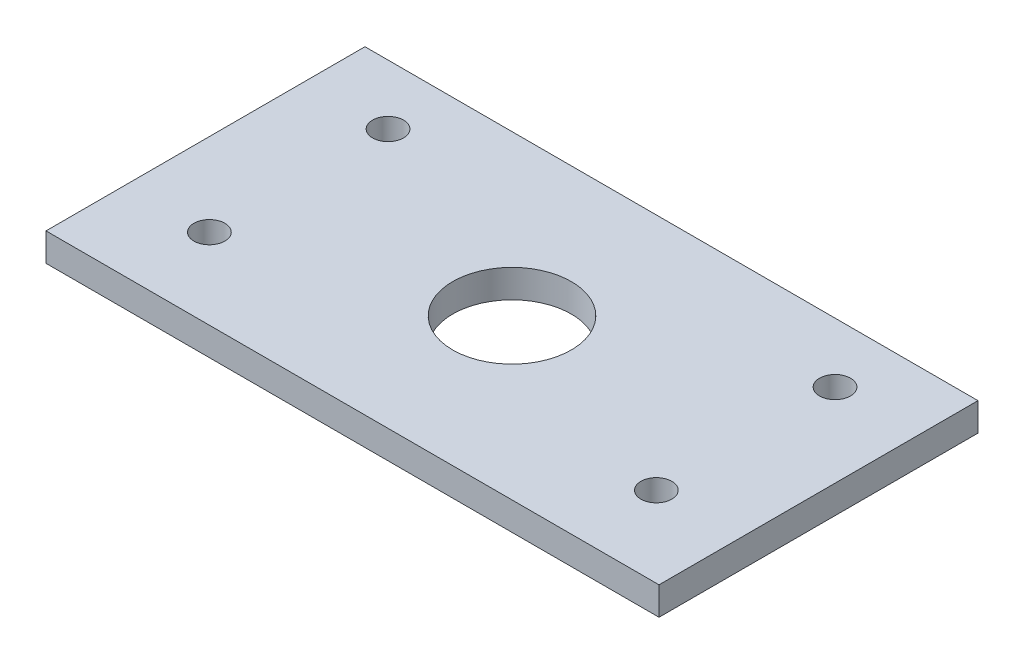
ISO-10303-21;
HEADER;
FILE_DESCRIPTION(('STEP AP214'),'2;1');
FILE_NAME('part.step','',(''),(''),'','','');
FILE_SCHEMA(('AUTOMOTIVE_DESIGN { 1 0 10303 214 1 1 1 1 }'));
ENDSEC;
DATA;
#1=APPLICATION_CONTEXT('core data for automotive mechanical design processes');
#2=APPLICATION_PROTOCOL_DEFINITION('international standard','automotive_design',2000,#1);
#3=PRODUCT_CONTEXT('',#1,'mechanical');
#4=PRODUCT('Part','Part','',(#3));
#5=PRODUCT_RELATED_PRODUCT_CATEGORY('part','',(#4));
#6=PRODUCT_DEFINITION_FORMATION('','',#4);
#7=PRODUCT_DEFINITION_CONTEXT('part definition',#1,'design');
#8=PRODUCT_DEFINITION('design','',#6,#7);
#9=PRODUCT_DEFINITION_SHAPE('','',#8);
#10=(LENGTH_UNIT() NAMED_UNIT(*) SI_UNIT(.MILLI.,.METRE.));
#11=(NAMED_UNIT(*) PLANE_ANGLE_UNIT() SI_UNIT($,.RADIAN.));
#12=(NAMED_UNIT(*) SI_UNIT($,.STERADIAN.) SOLID_ANGLE_UNIT());
#13=UNCERTAINTY_MEASURE_WITH_UNIT(LENGTH_MEASURE(1.E-05),#10,'distance_accuracy_value','');
#14=(GEOMETRIC_REPRESENTATION_CONTEXT(3) GLOBAL_UNCERTAINTY_ASSIGNED_CONTEXT((#13)) GLOBAL_UNIT_ASSIGNED_CONTEXT((#10,
#11,#12)) REPRESENTATION_CONTEXT('',''));
#15=CARTESIAN_POINT('',(0.,0.,0.));
#16=DIRECTION('',(0.,0.,1.));
#17=DIRECTION('',(1.,0.,0.));
#18=AXIS2_PLACEMENT_3D('',#15,#16,#17);
#19=CARTESIAN_POINT('',(54.4683637157339,17.8,28.3412624211949));
#20=DIRECTION('',(-1.,0.,0.));
#21=DIRECTION('',(0.,0.,1.));
#22=AXIS2_PLACEMENT_3D('',#19,#20,#21);
#23=PLANE('',#22);
#24=DIRECTION('',(0.,0.,-1.));
#25=VECTOR('',#24,1.);
#26=CARTESIAN_POINT('',(54.4683637157339,12.8,28.3412624211949));
#27=LINE('',#26,#25);
#28=CARTESIAN_POINT('',(54.4683637157339,12.8,28.3412624211949));
#29=VERTEX_POINT('',#28);
#30=CARTESIAN_POINT('',(54.4683637157339,12.8,-28.3412624211949));
#31=VERTEX_POINT('',#30);
#32=EDGE_CURVE('E102',#29,#31,#27,.T.);
#33=ORIENTED_EDGE('',*,*,#32,.T.);
#34=DIRECTION('',(0.,-1.,0.));
#35=VECTOR('',#34,1.);
#36=CARTESIAN_POINT('',(54.4683637157339,17.8,-28.3412624211949));
#37=LINE('',#36,#35);
#38=CARTESIAN_POINT('',(54.4683637157339,17.8,-28.3412624211949));
#39=VERTEX_POINT('',#38);
#40=EDGE_CURVE('E11',#39,#31,#37,.T.);
#41=ORIENTED_EDGE('',*,*,#40,.F.);
#42=DIRECTION('',(0.,0.,-1.));
#43=VECTOR('',#42,1.);
#44=CARTESIAN_POINT('',(54.4683637157339,17.8,28.3412624211949));
#45=LINE('',#44,#43);
#46=CARTESIAN_POINT('',(54.4683637157339,17.8,28.3412624211949));
#47=VERTEX_POINT('',#46);
#48=EDGE_CURVE('E90',#47,#39,#45,.T.);
#49=ORIENTED_EDGE('',*,*,#48,.F.);
#50=DIRECTION('',(0.,-1.,0.));
#51=VECTOR('',#50,1.);
#52=CARTESIAN_POINT('',(54.4683637157339,17.8,28.3412624211949));
#53=LINE('',#52,#51);
#54=EDGE_CURVE('E98',#47,#29,#53,.T.);
#55=ORIENTED_EDGE('',*,*,#54,.T.);
#56=EDGE_LOOP('',(#33,#41,#49,#55));
#57=FACE_BOUND('',#56,.T.);
#58=ADVANCED_FACE('F39',(#57),#23,.F.);
#59=CARTESIAN_POINT('',(-54.4683637157339,17.8,-28.3412624211949));
#60=DIRECTION('',(0.,0.,1.));
#61=DIRECTION('',(1.,0.,0.));
#62=AXIS2_PLACEMENT_3D('',#59,#60,#61);
#63=PLANE('',#62);
#64=DIRECTION('',(-1.,0.,0.));
#65=VECTOR('',#64,1.);
#66=CARTESIAN_POINT('',(-54.4683637157339,12.8,-28.3412624211949));
#67=LINE('',#66,#65);
#68=CARTESIAN_POINT('',(-54.4683637157339,12.8,-28.3412624211949));
#69=VERTEX_POINT('',#68);
#70=EDGE_CURVE('E94',#31,#69,#67,.T.);
#71=ORIENTED_EDGE('',*,*,#70,.T.);
#72=DIRECTION('',(0.,-1.,0.));
#73=VECTOR('',#72,1.);
#74=CARTESIAN_POINT('',(-54.4683637157339,17.8,-28.3412624211949));
#75=LINE('',#74,#73);
#76=CARTESIAN_POINT('',(-54.4683637157339,17.8,-28.3412624211949));
#77=VERTEX_POINT('',#76);
#78=EDGE_CURVE('E47',#77,#69,#75,.T.);
#79=ORIENTED_EDGE('',*,*,#78,.F.);
#80=DIRECTION('',(-1.,0.,0.));
#81=VECTOR('',#80,1.);
#82=CARTESIAN_POINT('',(-54.4683637157339,17.8,-28.3412624211949));
#83=LINE('',#82,#81);
#84=EDGE_CURVE('E85',#39,#77,#83,.T.);
#85=ORIENTED_EDGE('',*,*,#84,.F.);
#86=ORIENTED_EDGE('',*,*,#40,.T.);
#87=EDGE_LOOP('',(#71,#79,#85,#86));
#88=FACE_BOUND('',#87,.T.);
#89=ADVANCED_FACE('F93',(#88),#63,.F.);
#90=CARTESIAN_POINT('',(-54.4683637157339,17.8,28.3412624211949));
#91=DIRECTION('',(1.,0.,0.));
#92=DIRECTION('',(0.,0.,-1.));
#93=AXIS2_PLACEMENT_3D('',#90,#91,#92);
#94=PLANE('',#93);
#95=DIRECTION('',(0.,0.,1.));
#96=VECTOR('',#95,1.);
#97=CARTESIAN_POINT('',(-54.4683637157339,12.8,28.3412624211949));
#98=LINE('',#97,#96);
#99=CARTESIAN_POINT('',(-54.4683637157339,12.8,28.3412624211949));
#100=VERTEX_POINT('',#99);
#101=EDGE_CURVE('E72',#69,#100,#98,.T.);
#102=ORIENTED_EDGE('',*,*,#101,.T.);
#103=DIRECTION('',(0.,-1.,0.));
#104=VECTOR('',#103,1.);
#105=CARTESIAN_POINT('',(-54.4683637157339,17.8,28.3412624211949));
#106=LINE('',#105,#104);
#107=CARTESIAN_POINT('',(-54.4683637157339,17.8,28.3412624211949));
#108=VERTEX_POINT('',#107);
#109=EDGE_CURVE('E95',#108,#100,#106,.T.);
#110=ORIENTED_EDGE('',*,*,#109,.F.);
#111=DIRECTION('',(0.,0.,1.));
#112=VECTOR('',#111,1.);
#113=CARTESIAN_POINT('',(-54.4683637157339,17.8,28.3412624211949));
#114=LINE('',#113,#112);
#115=EDGE_CURVE('E88',#77,#108,#114,.T.);
#116=ORIENTED_EDGE('',*,*,#115,.F.);
#117=ORIENTED_EDGE('',*,*,#78,.T.);
#118=EDGE_LOOP('',(#102,#110,#116,#117));
#119=FACE_BOUND('',#118,.T.);
#120=ADVANCED_FACE('F96',(#119),#94,.F.);
#121=CARTESIAN_POINT('',(-54.4683637157339,17.8,28.3412624211949));
#122=DIRECTION('',(0.,0.,-1.));
#123=DIRECTION('',(-1.,0.,0.));
#124=AXIS2_PLACEMENT_3D('',#121,#122,#123);
#125=PLANE('',#124);
#126=DIRECTION('',(1.,0.,0.));
#127=VECTOR('',#126,1.);
#128=CARTESIAN_POINT('',(-54.4683637157339,12.8,28.3412624211949));
#129=LINE('',#128,#127);
#130=EDGE_CURVE('E78',#100,#29,#129,.T.);
#131=ORIENTED_EDGE('',*,*,#130,.T.);
#132=ORIENTED_EDGE('',*,*,#54,.F.);
#133=DIRECTION('',(1.,0.,0.));
#134=VECTOR('',#133,1.);
#135=CARTESIAN_POINT('',(-54.4683637157339,17.8,28.3412624211949));
#136=LINE('',#135,#134);
#137=EDGE_CURVE('E55',#108,#47,#136,.T.);
#138=ORIENTED_EDGE('',*,*,#137,.F.);
#139=ORIENTED_EDGE('',*,*,#109,.T.);
#140=EDGE_LOOP('',(#131,#132,#138,#139));
#141=FACE_BOUND('',#140,.T.);
#142=ADVANCED_FACE('F110',(#141),#125,.F.);
#143=CARTESIAN_POINT('',(0.,17.8,0.));
#144=DIRECTION('',(0.,-1.,0.));
#145=DIRECTION('',(0.,0.,-1.));
#146=AXIS2_PLACEMENT_3D('',#143,#144,#145);
#147=PLANE('',#146);
#148=CARTESIAN_POINT('',(0.,17.8,0.));
#149=DIRECTION('',(0.,1.,0.));
#150=DIRECTION('',(0.,0.,1.));
#151=AXIS2_PLACEMENT_3D('',#148,#149,#150);
#152=CIRCLE('',#151,10.5365280424915);
#153=CARTESIAN_POINT('',(0.,17.8,10.5365280424915));
#154=VERTEX_POINT('',#153);
#155=EDGE_CURVE('E140',#154,#154,#152,.T.);
#156=ORIENTED_EDGE('',*,*,#155,.F.);
#157=EDGE_LOOP('',(#156));
#158=FACE_BOUND('',#157,.T.);
#159=CARTESIAN_POINT('',(39.6759448357339,17.8,-17.7248438244637));
#160=DIRECTION('',(0.,1.,0.));
#161=DIRECTION('',(0.,0.,1.));
#162=AXIS2_PLACEMENT_3D('',#159,#160,#161);
#163=CIRCLE('',#162,2.75);
#164=CARTESIAN_POINT('',(39.6759448357339,17.8,-14.9748438244637));
#165=VERTEX_POINT('',#164);
#166=EDGE_CURVE('E125',#165,#165,#163,.T.);
#167=ORIENTED_EDGE('',*,*,#166,.F.);
#168=EDGE_LOOP('',(#167));
#169=FACE_BOUND('',#168,.T.);
#170=CARTESIAN_POINT('',(39.6759448357339,17.8,14.0251561755363));
#171=DIRECTION('',(0.,1.,0.));
#172=DIRECTION('',(0.,0.,1.));
#173=AXIS2_PLACEMENT_3D('',#170,#171,#172);
#174=CIRCLE('',#173,2.75);
#175=CARTESIAN_POINT('',(39.6759448357339,17.8,16.7751561755363));
#176=VERTEX_POINT('',#175);
#177=EDGE_CURVE('E132',#176,#176,#174,.T.);
#178=ORIENTED_EDGE('',*,*,#177,.F.);
#179=EDGE_LOOP('',(#178));
#180=FACE_BOUND('',#179,.T.);
#181=CARTESIAN_POINT('',(-39.7510453757339,17.8,14.0251561755363));
#182=DIRECTION('',(0.,1.,0.));
#183=DIRECTION('',(0.,0.,1.));
#184=AXIS2_PLACEMENT_3D('',#181,#182,#183);
#185=CIRCLE('',#184,2.75);
#186=CARTESIAN_POINT('',(-39.7510453757339,17.8,16.7751561755363));
#187=VERTEX_POINT('',#186);
#188=EDGE_CURVE('E119',#187,#187,#185,.T.);
#189=ORIENTED_EDGE('',*,*,#188,.F.);
#190=EDGE_LOOP('',(#189));
#191=FACE_BOUND('',#190,.T.);
#192=CARTESIAN_POINT('',(-39.7510453757339,17.8,-17.7248438244637));
#193=DIRECTION('',(0.,1.,0.));
#194=DIRECTION('',(0.,0.,1.));
#195=AXIS2_PLACEMENT_3D('',#192,#193,#194);
#196=CIRCLE('',#195,2.75);
#197=CARTESIAN_POINT('',(-39.7510453757339,17.8,-14.9748438244637));
#198=VERTEX_POINT('',#197);
#199=EDGE_CURVE('E116',#198,#198,#196,.T.);
#200=ORIENTED_EDGE('',*,*,#199,.F.);
#201=EDGE_LOOP('',(#200));
#202=FACE_BOUND('',#201,.T.);
#203=ORIENTED_EDGE('',*,*,#48,.T.);
#204=ORIENTED_EDGE('',*,*,#84,.T.);
#205=ORIENTED_EDGE('',*,*,#115,.T.);
#206=ORIENTED_EDGE('',*,*,#137,.T.);
#207=EDGE_LOOP('',(#203,#204,#205,#206));
#208=FACE_BOUND('',#207,.T.);
#209=ADVANCED_FACE('F86',(#158,#169,#180,#191,#202,#208),#147,.F.);
#210=CARTESIAN_POINT('',(0.,12.8,0.));
#211=DIRECTION('',(0.,-1.,0.));
#212=DIRECTION('',(0.,0.,-1.));
#213=AXIS2_PLACEMENT_3D('',#210,#211,#212);
#214=PLANE('',#213);
#215=CARTESIAN_POINT('',(0.,12.8,0.));
#216=DIRECTION('',(0.,1.,0.));
#217=DIRECTION('',(0.,0.,1.));
#218=AXIS2_PLACEMENT_3D('',#215,#216,#217);
#219=CIRCLE('',#218,10.5365280424915);
#220=CARTESIAN_POINT('',(0.,12.8,10.5365280424915));
#221=VERTEX_POINT('',#220);
#222=EDGE_CURVE('E126',#221,#221,#219,.T.);
#223=ORIENTED_EDGE('',*,*,#222,.T.);
#224=EDGE_LOOP('',(#223));
#225=FACE_BOUND('',#224,.T.);
#226=CARTESIAN_POINT('',(39.6759448357339,12.8,-17.7248438244637));
#227=DIRECTION('',(0.,1.,0.));
#228=DIRECTION('',(0.,0.,1.));
#229=AXIS2_PLACEMENT_3D('',#226,#227,#228);
#230=CIRCLE('',#229,2.75);
#231=CARTESIAN_POINT('',(39.6759448357339,12.8,-14.9748438244637));
#232=VERTEX_POINT('',#231);
#233=EDGE_CURVE('E122',#232,#232,#230,.T.);
#234=ORIENTED_EDGE('',*,*,#233,.T.);
#235=EDGE_LOOP('',(#234));
#236=FACE_BOUND('',#235,.T.);
#237=CARTESIAN_POINT('',(39.6759448357339,12.8,14.0251561755363));
#238=DIRECTION('',(0.,1.,0.));
#239=DIRECTION('',(0.,0.,1.));
#240=AXIS2_PLACEMENT_3D('',#237,#238,#239);
#241=CIRCLE('',#240,2.75);
#242=CARTESIAN_POINT('',(39.6759448357339,12.8,16.7751561755363));
#243=VERTEX_POINT('',#242);
#244=EDGE_CURVE('E129',#243,#243,#241,.T.);
#245=ORIENTED_EDGE('',*,*,#244,.T.);
#246=EDGE_LOOP('',(#245));
#247=FACE_BOUND('',#246,.T.);
#248=CARTESIAN_POINT('',(-39.7510453757339,12.8,14.0251561755363));
#249=DIRECTION('',(0.,1.,0.));
#250=DIRECTION('',(0.,0.,1.));
#251=AXIS2_PLACEMENT_3D('',#248,#249,#250);
#252=CIRCLE('',#251,2.75);
#253=CARTESIAN_POINT('',(-39.7510453757339,12.8,16.7751561755363));
#254=VERTEX_POINT('',#253);
#255=EDGE_CURVE('E135',#254,#254,#252,.T.);
#256=ORIENTED_EDGE('',*,*,#255,.T.);
#257=EDGE_LOOP('',(#256));
#258=FACE_BOUND('',#257,.T.);
#259=CARTESIAN_POINT('',(-39.7510453757339,12.8,-17.7248438244637));
#260=DIRECTION('',(0.,1.,0.));
#261=DIRECTION('',(0.,0.,1.));
#262=AXIS2_PLACEMENT_3D('',#259,#260,#261);
#263=CIRCLE('',#262,2.75);
#264=CARTESIAN_POINT('',(-39.7510453757339,12.8,-14.9748438244637));
#265=VERTEX_POINT('',#264);
#266=EDGE_CURVE('E105',#265,#265,#263,.T.);
#267=ORIENTED_EDGE('',*,*,#266,.T.);
#268=EDGE_LOOP('',(#267));
#269=FACE_BOUND('',#268,.T.);
#270=ORIENTED_EDGE('',*,*,#32,.F.);
#271=ORIENTED_EDGE('',*,*,#130,.F.);
#272=ORIENTED_EDGE('',*,*,#101,.F.);
#273=ORIENTED_EDGE('',*,*,#70,.F.);
#274=EDGE_LOOP('',(#270,#271,#272,#273));
#275=FACE_BOUND('',#274,.T.);
#276=ADVANCED_FACE('F113',(#225,#236,#247,#258,#269,#275),#214,.T.);
#277=CARTESIAN_POINT('',(-39.7510453757339,12.8,-17.7248438244637));
#278=DIRECTION('',(0.,1.,0.));
#279=DIRECTION('',(0.,0.,1.));
#280=AXIS2_PLACEMENT_3D('',#277,#278,#279);
#281=CYLINDRICAL_SURFACE('',#280,2.75);
#282=ORIENTED_EDGE('',*,*,#266,.F.);
#283=EDGE_LOOP('',(#282));
#284=FACE_BOUND('',#283,.T.);
#285=ORIENTED_EDGE('',*,*,#199,.T.);
#286=EDGE_LOOP('',(#285));
#287=FACE_BOUND('',#286,.T.);
#288=ADVANCED_FACE('F166',(#284,#287),#281,.F.);
#289=CARTESIAN_POINT('',(-39.7510453757339,12.8,14.0251561755363));
#290=DIRECTION('',(0.,1.,0.));
#291=DIRECTION('',(0.,0.,1.));
#292=AXIS2_PLACEMENT_3D('',#289,#290,#291);
#293=CYLINDRICAL_SURFACE('',#292,2.75);
#294=ORIENTED_EDGE('',*,*,#255,.F.);
#295=EDGE_LOOP('',(#294));
#296=FACE_BOUND('',#295,.T.);
#297=ORIENTED_EDGE('',*,*,#188,.T.);
#298=EDGE_LOOP('',(#297));
#299=FACE_BOUND('',#298,.T.);
#300=ADVANCED_FACE('F168',(#296,#299),#293,.F.);
#301=CARTESIAN_POINT('',(39.6759448357339,12.8,14.0251561755363));
#302=DIRECTION('',(0.,1.,0.));
#303=DIRECTION('',(0.,0.,1.));
#304=AXIS2_PLACEMENT_3D('',#301,#302,#303);
#305=CYLINDRICAL_SURFACE('',#304,2.75);
#306=ORIENTED_EDGE('',*,*,#244,.F.);
#307=EDGE_LOOP('',(#306));
#308=FACE_BOUND('',#307,.T.);
#309=ORIENTED_EDGE('',*,*,#177,.T.);
#310=EDGE_LOOP('',(#309));
#311=FACE_BOUND('',#310,.T.);
#312=ADVANCED_FACE('F175',(#308,#311),#305,.F.);
#313=CARTESIAN_POINT('',(39.6759448357339,12.8,-17.7248438244637));
#314=DIRECTION('',(0.,1.,0.));
#315=DIRECTION('',(0.,0.,1.));
#316=AXIS2_PLACEMENT_3D('',#313,#314,#315);
#317=CYLINDRICAL_SURFACE('',#316,2.75);
#318=ORIENTED_EDGE('',*,*,#233,.F.);
#319=EDGE_LOOP('',(#318));
#320=FACE_BOUND('',#319,.T.);
#321=ORIENTED_EDGE('',*,*,#166,.T.);
#322=EDGE_LOOP('',(#321));
#323=FACE_BOUND('',#322,.T.);
#324=ADVANCED_FACE('F151',(#320,#323),#317,.F.);
#325=CARTESIAN_POINT('',(0.,12.8,0.));
#326=DIRECTION('',(0.,1.,0.));
#327=DIRECTION('',(0.,0.,1.));
#328=AXIS2_PLACEMENT_3D('',#325,#326,#327);
#329=CYLINDRICAL_SURFACE('',#328,10.5365280424915);
#330=ORIENTED_EDGE('',*,*,#222,.F.);
#331=EDGE_LOOP('',(#330));
#332=FACE_BOUND('',#331,.T.);
#333=ORIENTED_EDGE('',*,*,#155,.T.);
#334=EDGE_LOOP('',(#333));
#335=FACE_BOUND('',#334,.T.);
#336=ADVANCED_FACE('F148',(#332,#335),#329,.F.);
#337=CLOSED_SHELL('',(#58,#89,#120,#142,#209,#276,#288,#300,#312,#324,#336));
#338=MANIFOLD_SOLID_BREP('B2',#337);
#339=ADVANCED_BREP_SHAPE_REPRESENTATION('',(#18,#338),#14);
#340=SHAPE_DEFINITION_REPRESENTATION(#9,#339);
ENDSEC;
END-ISO-10303-21;
